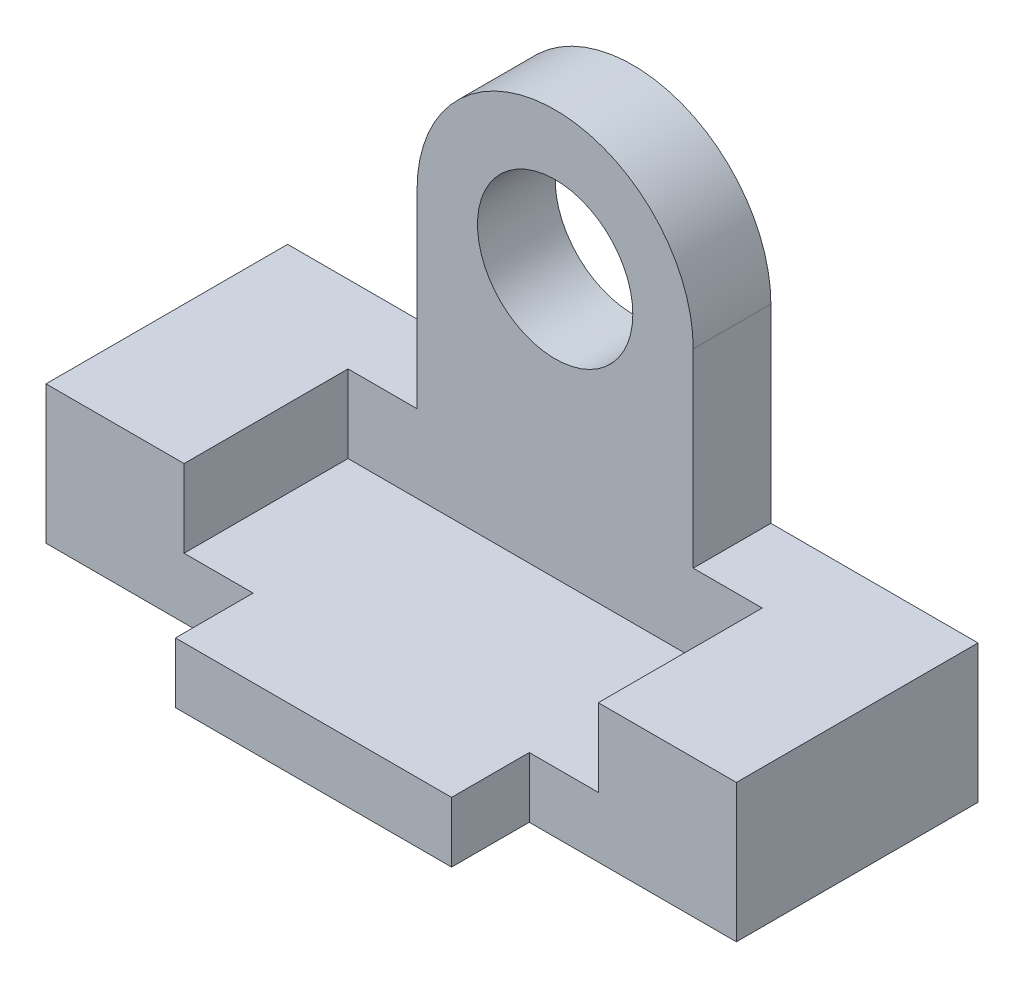
ISO-10303-21;
HEADER;
FILE_DESCRIPTION(('STEP AP214'),'2;1');
FILE_NAME('part.step','',(''),(''),'','','');
FILE_SCHEMA(('AUTOMOTIVE_DESIGN { 1 0 10303 214 1 1 1 1 }'));
ENDSEC;
DATA;
#1=APPLICATION_CONTEXT('core data for automotive mechanical design processes');
#2=APPLICATION_PROTOCOL_DEFINITION('international standard','automotive_design',2000,#1);
#3=PRODUCT_CONTEXT('',#1,'mechanical');
#4=PRODUCT('Part','Part','',(#3));
#5=PRODUCT_RELATED_PRODUCT_CATEGORY('part','',(#4));
#6=PRODUCT_DEFINITION_FORMATION('','',#4);
#7=PRODUCT_DEFINITION_CONTEXT('part definition',#1,'design');
#8=PRODUCT_DEFINITION('design','',#6,#7);
#9=PRODUCT_DEFINITION_SHAPE('','',#8);
#10=(LENGTH_UNIT() NAMED_UNIT(*) SI_UNIT(.MILLI.,.METRE.));
#11=(NAMED_UNIT(*) PLANE_ANGLE_UNIT() SI_UNIT($,.RADIAN.));
#12=(NAMED_UNIT(*) SI_UNIT($,.STERADIAN.) SOLID_ANGLE_UNIT());
#13=UNCERTAINTY_MEASURE_WITH_UNIT(LENGTH_MEASURE(1.E-05),#10,'distance_accuracy_value','');
#14=(GEOMETRIC_REPRESENTATION_CONTEXT(3) GLOBAL_UNCERTAINTY_ASSIGNED_CONTEXT((#13)) GLOBAL_UNIT_ASSIGNED_CONTEXT((#10,
#11,#12)) REPRESENTATION_CONTEXT('',''));
#15=CARTESIAN_POINT('',(0.,0.,0.));
#16=DIRECTION('',(0.,0.,1.));
#17=DIRECTION('',(1.,0.,0.));
#18=AXIS2_PLACEMENT_3D('',#15,#16,#17);
#19=CARTESIAN_POINT('',(0.,16.,0.));
#20=DIRECTION('',(0.,-1.,0.));
#21=DIRECTION('',(0.,0.,-1.));
#22=AXIS2_PLACEMENT_3D('',#19,#20,#21);
#23=PLANE('',#22);
#24=DIRECTION('',(0.,0.,1.));
#25=VECTOR('',#24,1.);
#26=CARTESIAN_POINT('',(-16.,16.,-63.6789693934969));
#27=LINE('',#26,#25);
#28=CARTESIAN_POINT('',(-16.,16.,-14.));
#29=VERTEX_POINT('',#28);
#30=CARTESIAN_POINT('',(-16.,16.,-5.));
#31=VERTEX_POINT('',#30);
#32=EDGE_CURVE('E61',#29,#31,#27,.T.);
#33=ORIENTED_EDGE('',*,*,#32,.F.);
#34=DIRECTION('',(-1.,0.,0.));
#35=VECTOR('',#34,1.);
#36=CARTESIAN_POINT('',(-40.,16.,-14.));
#37=LINE('',#36,#35);
#38=CARTESIAN_POINT('',(-40.,16.,-14.));
#39=VERTEX_POINT('',#38);
#40=EDGE_CURVE('E287',#29,#39,#37,.T.);
#41=ORIENTED_EDGE('',*,*,#40,.T.);
#42=DIRECTION('',(0.,0.,1.));
#43=VECTOR('',#42,1.);
#44=CARTESIAN_POINT('',(-40.,16.,14.));
#45=LINE('',#44,#43);
#46=CARTESIAN_POINT('',(-40.,16.,14.));
#47=VERTEX_POINT('',#46);
#48=EDGE_CURVE('E291',#39,#47,#45,.T.);
#49=ORIENTED_EDGE('',*,*,#48,.T.);
#50=DIRECTION('',(1.,0.,0.));
#51=VECTOR('',#50,1.);
#52=CARTESIAN_POINT('',(-40.,16.,14.));
#53=LINE('',#52,#51);
#54=CARTESIAN_POINT('',(-24.,16.,14.));
#55=VERTEX_POINT('',#54);
#56=EDGE_CURVE('E295',#47,#55,#53,.T.);
#57=ORIENTED_EDGE('',*,*,#56,.T.);
#58=DIRECTION('',(0.,0.,1.));
#59=VECTOR('',#58,1.);
#60=CARTESIAN_POINT('',(-24.,16.,14.));
#61=LINE('',#60,#59);
#62=CARTESIAN_POINT('',(-24.,16.,-5.));
#63=VERTEX_POINT('',#62);
#64=EDGE_CURVE('E159',#63,#55,#61,.T.);
#65=ORIENTED_EDGE('',*,*,#64,.F.);
#66=DIRECTION('',(-1.,0.,0.));
#67=VECTOR('',#66,1.);
#68=CARTESIAN_POINT('',(-24.,16.,-5.));
#69=LINE('',#68,#67);
#70=EDGE_CURVE('E157',#31,#63,#69,.T.);
#71=ORIENTED_EDGE('',*,*,#70,.F.);
#72=EDGE_LOOP('',(#33,#41,#49,#57,#65,#71));
#73=FACE_BOUND('',#72,.T.);
#74=ADVANCED_FACE('F45',(#73),#23,.F.);
#75=CARTESIAN_POINT('',(-40.,16.,14.));
#76=DIRECTION('',(0.,0.,-1.));
#77=DIRECTION('',(-1.,0.,0.));
#78=AXIS2_PLACEMENT_3D('',#75,#76,#77);
#79=PLANE('',#78);
#80=DIRECTION('',(0.,-1.,0.));
#81=VECTOR('',#80,1.);
#82=CARTESIAN_POINT('',(-16.,0.,14.));
#83=LINE('',#82,#81);
#84=CARTESIAN_POINT('',(-16.,7.,14.));
#85=VERTEX_POINT('',#84);
#86=CARTESIAN_POINT('',(-16.,0.,14.));
#87=VERTEX_POINT('',#86);
#88=EDGE_CURVE('E210',#85,#87,#83,.T.);
#89=ORIENTED_EDGE('',*,*,#88,.F.);
#90=DIRECTION('',(1.,0.,0.));
#91=VECTOR('',#90,1.);
#92=CARTESIAN_POINT('',(-24.,7.,14.));
#93=LINE('',#92,#91);
#94=CARTESIAN_POINT('',(-24.,7.,14.));
#95=VERTEX_POINT('',#94);
#96=EDGE_CURVE('E252',#95,#85,#93,.T.);
#97=ORIENTED_EDGE('',*,*,#96,.F.);
#98=DIRECTION('',(0.,1.,0.));
#99=VECTOR('',#98,1.);
#100=CARTESIAN_POINT('',(-24.,7.,14.));
#101=LINE('',#100,#99);
#102=EDGE_CURVE('E264',#95,#55,#101,.T.);
#103=ORIENTED_EDGE('',*,*,#102,.T.);
#104=ORIENTED_EDGE('',*,*,#56,.F.);
#105=DIRECTION('',(0.,-1.,0.));
#106=VECTOR('',#105,1.);
#107=CARTESIAN_POINT('',(-40.,16.,14.));
#108=LINE('',#107,#106);
#109=CARTESIAN_POINT('',(-40.,0.,14.));
#110=VERTEX_POINT('',#109);
#111=EDGE_CURVE('E314',#47,#110,#108,.T.);
#112=ORIENTED_EDGE('',*,*,#111,.T.);
#113=DIRECTION('',(1.,0.,0.));
#114=VECTOR('',#113,1.);
#115=CARTESIAN_POINT('',(-40.,0.,14.));
#116=LINE('',#115,#114);
#117=EDGE_CURVE('E288',#110,#87,#116,.T.);
#118=ORIENTED_EDGE('',*,*,#117,.T.);
#119=EDGE_LOOP('',(#89,#97,#103,#104,#112,#118));
#120=FACE_BOUND('',#119,.T.);
#121=ADVANCED_FACE('F332',(#120),#79,.F.);
#122=DIRECTION('',(0.,1.,0.));
#123=VECTOR('',#122,1.);
#124=CARTESIAN_POINT('',(16.,0.,14.));
#125=LINE('',#124,#123);
#126=CARTESIAN_POINT('',(16.,0.,14.));
#127=VERTEX_POINT('',#126);
#128=CARTESIAN_POINT('',(16.,7.,14.));
#129=VERTEX_POINT('',#128);
#130=EDGE_CURVE('E216',#127,#129,#125,.T.);
#131=ORIENTED_EDGE('',*,*,#130,.F.);
#132=CARTESIAN_POINT('',(40.,0.,14.));
#133=VERTEX_POINT('',#132);
#134=EDGE_CURVE('E308',#127,#133,#116,.T.);
#135=ORIENTED_EDGE('',*,*,#134,.T.);
#136=DIRECTION('',(0.,-1.,0.));
#137=VECTOR('',#136,1.);
#138=CARTESIAN_POINT('',(40.,16.,14.));
#139=LINE('',#138,#137);
#140=CARTESIAN_POINT('',(40.,16.,14.));
#141=VERTEX_POINT('',#140);
#142=EDGE_CURVE('E298',#141,#133,#139,.T.);
#143=ORIENTED_EDGE('',*,*,#142,.F.);
#144=CARTESIAN_POINT('',(24.,16.,14.));
#145=VERTEX_POINT('',#144);
#146=EDGE_CURVE('E294',#145,#141,#53,.T.);
#147=ORIENTED_EDGE('',*,*,#146,.F.);
#148=DIRECTION('',(0.,1.,0.));
#149=VECTOR('',#148,1.);
#150=CARTESIAN_POINT('',(24.,7.,14.));
#151=LINE('',#150,#149);
#152=CARTESIAN_POINT('',(24.,7.,14.));
#153=VERTEX_POINT('',#152);
#154=EDGE_CURVE('E278',#153,#145,#151,.T.);
#155=ORIENTED_EDGE('',*,*,#154,.F.);
#156=EDGE_CURVE('E251',#129,#153,#93,.T.);
#157=ORIENTED_EDGE('',*,*,#156,.F.);
#158=EDGE_LOOP('',(#131,#135,#143,#147,#155,#157));
#159=FACE_BOUND('',#158,.T.);
#160=ADVANCED_FACE('F364',(#159),#79,.F.);
#161=CARTESIAN_POINT('',(40.,16.,14.));
#162=DIRECTION('',(-1.,0.,0.));
#163=DIRECTION('',(0.,0.,1.));
#164=AXIS2_PLACEMENT_3D('',#161,#162,#163);
#165=PLANE('',#164);
#166=DIRECTION('',(0.,0.,-1.));
#167=VECTOR('',#166,1.);
#168=CARTESIAN_POINT('',(40.,0.,14.));
#169=LINE('',#168,#167);
#170=CARTESIAN_POINT('',(40.,0.,-14.));
#171=VERTEX_POINT('',#170);
#172=EDGE_CURVE('E274',#133,#171,#169,.T.);
#173=ORIENTED_EDGE('',*,*,#172,.T.);
#174=DIRECTION('',(0.,-1.,0.));
#175=VECTOR('',#174,1.);
#176=CARTESIAN_POINT('',(40.,16.,-14.));
#177=LINE('',#176,#175);
#178=CARTESIAN_POINT('',(40.,16.,-14.));
#179=VERTEX_POINT('',#178);
#180=EDGE_CURVE('E11',#179,#171,#177,.T.);
#181=ORIENTED_EDGE('',*,*,#180,.F.);
#182=DIRECTION('',(0.,0.,-1.));
#183=VECTOR('',#182,1.);
#184=CARTESIAN_POINT('',(40.,16.,14.));
#185=LINE('',#184,#183);
#186=EDGE_CURVE('E284',#141,#179,#185,.T.);
#187=ORIENTED_EDGE('',*,*,#186,.F.);
#188=ORIENTED_EDGE('',*,*,#142,.T.);
#189=EDGE_LOOP('',(#173,#181,#187,#188));
#190=FACE_BOUND('',#189,.T.);
#191=ADVANCED_FACE('F47',(#190),#165,.F.);
#192=CARTESIAN_POINT('',(-40.,16.,-14.));
#193=DIRECTION('',(0.,0.,1.));
#194=DIRECTION('',(1.,0.,0.));
#195=AXIS2_PLACEMENT_3D('',#192,#193,#194);
#196=PLANE('',#195);
#197=DIRECTION('',(-1.,0.,0.));
#198=VECTOR('',#197,1.);
#199=CARTESIAN_POINT('',(-40.,0.,-14.));
#200=LINE('',#199,#198);
#201=CARTESIAN_POINT('',(-40.,0.,-14.));
#202=VERTEX_POINT('',#201);
#203=EDGE_CURVE('E302',#171,#202,#200,.T.);
#204=ORIENTED_EDGE('',*,*,#203,.T.);
#205=DIRECTION('',(0.,-1.,0.));
#206=VECTOR('',#205,1.);
#207=CARTESIAN_POINT('',(-40.,16.,-14.));
#208=LINE('',#207,#206);
#209=EDGE_CURVE('E54',#39,#202,#208,.T.);
#210=ORIENTED_EDGE('',*,*,#209,.F.);
#211=ORIENTED_EDGE('',*,*,#40,.F.);
#212=DIRECTION('',(0.,1.,0.));
#213=VECTOR('',#212,1.);
#214=CARTESIAN_POINT('',(-16.,16.,-14.));
#215=LINE('',#214,#213);
#216=CARTESIAN_POINT('',(-16.,38.,-14.));
#217=VERTEX_POINT('',#216);
#218=EDGE_CURVE('E174',#29,#217,#215,.T.);
#219=ORIENTED_EDGE('',*,*,#218,.T.);
#220=CARTESIAN_POINT('',(0.,38.,-14.));
#221=DIRECTION('',(0.,0.,1.));
#222=DIRECTION('',(1.,0.,0.));
#223=AXIS2_PLACEMENT_3D('',#220,#221,#222);
#224=CIRCLE('',#223,16.);
#225=CARTESIAN_POINT('',(16.,38.,-14.));
#226=VERTEX_POINT('',#225);
#227=EDGE_CURVE('E340',#217,#226,#224,.F.);
#228=ORIENTED_EDGE('',*,*,#227,.T.);
#229=DIRECTION('',(0.,-1.,0.));
#230=VECTOR('',#229,1.);
#231=CARTESIAN_POINT('',(16.,16.,-14.));
#232=LINE('',#231,#230);
#233=CARTESIAN_POINT('',(16.,16.,-14.));
#234=VERTEX_POINT('',#233);
#235=EDGE_CURVE('E200',#226,#234,#232,.T.);
#236=ORIENTED_EDGE('',*,*,#235,.T.);
#237=EDGE_CURVE('E69',#179,#234,#37,.T.);
#238=ORIENTED_EDGE('',*,*,#237,.F.);
#239=ORIENTED_EDGE('',*,*,#180,.T.);
#240=EDGE_LOOP('',(#204,#210,#211,#219,#228,#236,#238,#239));
#241=FACE_BOUND('',#240,.T.);
#242=CARTESIAN_POINT('',(0.,38.,-14.));
#243=DIRECTION('',(0.,0.,1.));
#244=DIRECTION('',(1.,0.,0.));
#245=AXIS2_PLACEMENT_3D('',#242,#243,#244);
#246=CIRCLE('',#245,9.);
#247=CARTESIAN_POINT('',(9.,38.,-14.));
#248=VERTEX_POINT('',#247);
#249=EDGE_CURVE('E206',#248,#248,#246,.F.);
#250=ORIENTED_EDGE('',*,*,#249,.F.);
#251=EDGE_LOOP('',(#250));
#252=FACE_BOUND('',#251,.T.);
#253=ADVANCED_FACE('F346',(#241,#252),#196,.F.);
#254=CARTESIAN_POINT('',(-40.,16.,14.));
#255=DIRECTION('',(1.,0.,0.));
#256=DIRECTION('',(0.,0.,-1.));
#257=AXIS2_PLACEMENT_3D('',#254,#255,#256);
#258=PLANE('',#257);
#259=DIRECTION('',(0.,0.,1.));
#260=VECTOR('',#259,1.);
#261=CARTESIAN_POINT('',(-40.,0.,14.));
#262=LINE('',#261,#260);
#263=EDGE_CURVE('E305',#202,#110,#262,.T.);
#264=ORIENTED_EDGE('',*,*,#263,.T.);
#265=ORIENTED_EDGE('',*,*,#111,.F.);
#266=ORIENTED_EDGE('',*,*,#48,.F.);
#267=ORIENTED_EDGE('',*,*,#209,.T.);
#268=EDGE_LOOP('',(#264,#265,#266,#267));
#269=FACE_BOUND('',#268,.T.);
#270=ADVANCED_FACE('F323',(#269),#258,.F.);
#271=ORIENTED_EDGE('',*,*,#237,.T.);
#272=DIRECTION('',(0.,0.,1.));
#273=VECTOR('',#272,1.);
#274=CARTESIAN_POINT('',(16.,16.,-63.6789693934969));
#275=LINE('',#274,#273);
#276=CARTESIAN_POINT('',(16.,16.,-5.));
#277=VERTEX_POINT('',#276);
#278=EDGE_CURVE('E176',#234,#277,#275,.T.);
#279=ORIENTED_EDGE('',*,*,#278,.T.);
#280=CARTESIAN_POINT('',(24.,16.,-5.));
#281=VERTEX_POINT('',#280);
#282=EDGE_CURVE('E164',#281,#277,#69,.T.);
#283=ORIENTED_EDGE('',*,*,#282,.F.);
#284=DIRECTION('',(0.,0.,-1.));
#285=VECTOR('',#284,1.);
#286=CARTESIAN_POINT('',(24.,16.,14.));
#287=LINE('',#286,#285);
#288=EDGE_CURVE('E165',#145,#281,#287,.T.);
#289=ORIENTED_EDGE('',*,*,#288,.F.);
#290=ORIENTED_EDGE('',*,*,#146,.T.);
#291=ORIENTED_EDGE('',*,*,#186,.T.);
#292=EDGE_LOOP('',(#271,#279,#283,#289,#290,#291));
#293=FACE_BOUND('',#292,.T.);
#294=ADVANCED_FACE('F354',(#293),#23,.F.);
#295=CARTESIAN_POINT('',(0.,0.,0.));
#296=DIRECTION('',(0.,-1.,0.));
#297=DIRECTION('',(0.,0.,-1.));
#298=AXIS2_PLACEMENT_3D('',#295,#296,#297);
#299=PLANE('',#298);
#300=ORIENTED_EDGE('',*,*,#172,.F.);
#301=ORIENTED_EDGE('',*,*,#134,.F.);
#302=DIRECTION('',(0.,0.,-1.));
#303=VECTOR('',#302,1.);
#304=CARTESIAN_POINT('',(16.,0.,23.));
#305=LINE('',#304,#303);
#306=CARTESIAN_POINT('',(16.,0.,23.));
#307=VERTEX_POINT('',#306);
#308=EDGE_CURVE('E239',#307,#127,#305,.T.);
#309=ORIENTED_EDGE('',*,*,#308,.F.);
#310=DIRECTION('',(1.,0.,0.));
#311=VECTOR('',#310,1.);
#312=CARTESIAN_POINT('',(-16.,0.,23.));
#313=LINE('',#312,#311);
#314=CARTESIAN_POINT('',(-16.,0.,23.));
#315=VERTEX_POINT('',#314);
#316=EDGE_CURVE('E215',#315,#307,#313,.T.);
#317=ORIENTED_EDGE('',*,*,#316,.F.);
#318=DIRECTION('',(0.,0.,-1.));
#319=VECTOR('',#318,1.);
#320=CARTESIAN_POINT('',(-16.,0.,23.));
#321=LINE('',#320,#319);
#322=EDGE_CURVE('E243',#315,#87,#321,.T.);
#323=ORIENTED_EDGE('',*,*,#322,.T.);
#324=ORIENTED_EDGE('',*,*,#117,.F.);
#325=ORIENTED_EDGE('',*,*,#263,.F.);
#326=ORIENTED_EDGE('',*,*,#203,.F.);
#327=EDGE_LOOP('',(#300,#301,#309,#317,#323,#324,#325,#326));
#328=FACE_BOUND('',#327,.T.);
#329=ADVANCED_FACE('F329',(#328),#299,.T.);
#330=CARTESIAN_POINT('',(-24.,7.,14.));
#331=DIRECTION('',(-1.,0.,0.));
#332=DIRECTION('',(0.,0.,1.));
#333=AXIS2_PLACEMENT_3D('',#330,#331,#332);
#334=PLANE('',#333);
#335=ORIENTED_EDGE('',*,*,#64,.T.);
#336=ORIENTED_EDGE('',*,*,#102,.F.);
#337=DIRECTION('',(0.,0.,1.));
#338=VECTOR('',#337,1.);
#339=CARTESIAN_POINT('',(-24.,7.,14.));
#340=LINE('',#339,#338);
#341=CARTESIAN_POINT('',(-24.,7.,-5.));
#342=VERTEX_POINT('',#341);
#343=EDGE_CURVE('E247',#342,#95,#340,.T.);
#344=ORIENTED_EDGE('',*,*,#343,.F.);
#345=DIRECTION('',(0.,1.,0.));
#346=VECTOR('',#345,1.);
#347=CARTESIAN_POINT('',(-24.,7.,-5.));
#348=LINE('',#347,#346);
#349=EDGE_CURVE('E271',#342,#63,#348,.T.);
#350=ORIENTED_EDGE('',*,*,#349,.T.);
#351=EDGE_LOOP('',(#335,#336,#344,#350));
#352=FACE_BOUND('',#351,.T.);
#353=ADVANCED_FACE('F386',(#352),#334,.F.);
#354=CARTESIAN_POINT('',(-24.,7.,-5.));
#355=DIRECTION('',(0.,0.,-1.));
#356=DIRECTION('',(-1.,0.,0.));
#357=AXIS2_PLACEMENT_3D('',#354,#355,#356);
#358=PLANE('',#357);
#359=ORIENTED_EDGE('',*,*,#282,.T.);
#360=DIRECTION('',(0.,1.,0.));
#361=VECTOR('',#360,1.);
#362=CARTESIAN_POINT('',(16.,16.,-5.));
#363=LINE('',#362,#361);
#364=CARTESIAN_POINT('',(16.,38.,-5.));
#365=VERTEX_POINT('',#364);
#366=EDGE_CURVE('E185',#277,#365,#363,.T.);
#367=ORIENTED_EDGE('',*,*,#366,.T.);
#368=CARTESIAN_POINT('',(0.,38.,-5.));
#369=DIRECTION('',(0.,0.,1.));
#370=DIRECTION('',(1.,0.,0.));
#371=AXIS2_PLACEMENT_3D('',#368,#369,#370);
#372=CIRCLE('',#371,16.);
#373=CARTESIAN_POINT('',(-16.,38.,-5.));
#374=VERTEX_POINT('',#373);
#375=EDGE_CURVE('E177',#365,#374,#372,.T.);
#376=ORIENTED_EDGE('',*,*,#375,.T.);
#377=DIRECTION('',(0.,-1.,0.));
#378=VECTOR('',#377,1.);
#379=CARTESIAN_POINT('',(-16.,16.,-5.));
#380=LINE('',#379,#378);
#381=EDGE_CURVE('E172',#374,#31,#380,.T.);
#382=ORIENTED_EDGE('',*,*,#381,.T.);
#383=ORIENTED_EDGE('',*,*,#70,.T.);
#384=ORIENTED_EDGE('',*,*,#349,.F.);
#385=DIRECTION('',(-1.,0.,0.));
#386=VECTOR('',#385,1.);
#387=CARTESIAN_POINT('',(-24.,7.,-5.));
#388=LINE('',#387,#386);
#389=CARTESIAN_POINT('',(24.,7.,-5.));
#390=VERTEX_POINT('',#389);
#391=EDGE_CURVE('E260',#390,#342,#388,.T.);
#392=ORIENTED_EDGE('',*,*,#391,.F.);
#393=DIRECTION('',(0.,1.,0.));
#394=VECTOR('',#393,1.);
#395=CARTESIAN_POINT('',(24.,7.,-5.));
#396=LINE('',#395,#394);
#397=EDGE_CURVE('E275',#390,#281,#396,.T.);
#398=ORIENTED_EDGE('',*,*,#397,.T.);
#399=EDGE_LOOP('',(#359,#367,#376,#382,#383,#384,#392,#398));
#400=FACE_BOUND('',#399,.T.);
#401=CARTESIAN_POINT('',(0.,38.,-5.));
#402=DIRECTION('',(0.,0.,1.));
#403=DIRECTION('',(1.,0.,0.));
#404=AXIS2_PLACEMENT_3D('',#401,#402,#403);
#405=CIRCLE('',#404,9.);
#406=CARTESIAN_POINT('',(9.,38.,-5.));
#407=VERTEX_POINT('',#406);
#408=EDGE_CURVE('E186',#407,#407,#405,.T.);
#409=ORIENTED_EDGE('',*,*,#408,.F.);
#410=EDGE_LOOP('',(#409));
#411=FACE_BOUND('',#410,.T.);
#412=ADVANCED_FACE('F180',(#400,#411),#358,.F.);
#413=CARTESIAN_POINT('',(24.,7.,14.));
#414=DIRECTION('',(1.,0.,0.));
#415=DIRECTION('',(0.,0.,-1.));
#416=AXIS2_PLACEMENT_3D('',#413,#414,#415);
#417=PLANE('',#416);
#418=ORIENTED_EDGE('',*,*,#288,.T.);
#419=ORIENTED_EDGE('',*,*,#397,.F.);
#420=DIRECTION('',(0.,0.,-1.));
#421=VECTOR('',#420,1.);
#422=CARTESIAN_POINT('',(24.,7.,14.));
#423=LINE('',#422,#421);
#424=EDGE_CURVE('E256',#153,#390,#423,.T.);
#425=ORIENTED_EDGE('',*,*,#424,.F.);
#426=ORIENTED_EDGE('',*,*,#154,.T.);
#427=EDGE_LOOP('',(#418,#419,#425,#426));
#428=FACE_BOUND('',#427,.T.);
#429=ADVANCED_FACE('F359',(#428),#417,.F.);
#430=CARTESIAN_POINT('',(0.,7.,0.));
#431=DIRECTION('',(0.,-1.,0.));
#432=DIRECTION('',(0.,0.,-1.));
#433=AXIS2_PLACEMENT_3D('',#430,#431,#432);
#434=PLANE('',#433);
#435=ORIENTED_EDGE('',*,*,#343,.T.);
#436=ORIENTED_EDGE('',*,*,#96,.T.);
#437=DIRECTION('',(0.,0.,-1.));
#438=VECTOR('',#437,1.);
#439=CARTESIAN_POINT('',(-16.,7.,23.));
#440=LINE('',#439,#438);
#441=CARTESIAN_POINT('',(-16.,7.,23.));
#442=VERTEX_POINT('',#441);
#443=EDGE_CURVE('E225',#442,#85,#440,.T.);
#444=ORIENTED_EDGE('',*,*,#443,.F.);
#445=DIRECTION('',(-1.,0.,0.));
#446=VECTOR('',#445,1.);
#447=CARTESIAN_POINT('',(-16.,7.,23.));
#448=LINE('',#447,#446);
#449=CARTESIAN_POINT('',(16.,7.,23.));
#450=VERTEX_POINT('',#449);
#451=EDGE_CURVE('E222',#450,#442,#448,.T.);
#452=ORIENTED_EDGE('',*,*,#451,.F.);
#453=DIRECTION('',(0.,0.,-1.));
#454=VECTOR('',#453,1.);
#455=CARTESIAN_POINT('',(16.,7.,23.));
#456=LINE('',#455,#454);
#457=EDGE_CURVE('E235',#450,#129,#456,.T.);
#458=ORIENTED_EDGE('',*,*,#457,.T.);
#459=ORIENTED_EDGE('',*,*,#156,.T.);
#460=ORIENTED_EDGE('',*,*,#424,.T.);
#461=ORIENTED_EDGE('',*,*,#391,.T.);
#462=EDGE_LOOP('',(#435,#436,#444,#452,#458,#459,#460,#461));
#463=FACE_BOUND('',#462,.T.);
#464=ADVANCED_FACE('F383',(#463),#434,.F.);
#465=CARTESIAN_POINT('',(-16.,0.,23.));
#466=DIRECTION('',(1.,0.,0.));
#467=DIRECTION('',(0.,0.,-1.));
#468=AXIS2_PLACEMENT_3D('',#465,#466,#467);
#469=PLANE('',#468);
#470=ORIENTED_EDGE('',*,*,#88,.T.);
#471=ORIENTED_EDGE('',*,*,#322,.F.);
#472=DIRECTION('',(0.,-1.,0.));
#473=VECTOR('',#472,1.);
#474=CARTESIAN_POINT('',(-16.,0.,23.));
#475=LINE('',#474,#473);
#476=EDGE_CURVE('E211',#442,#315,#475,.T.);
#477=ORIENTED_EDGE('',*,*,#476,.F.);
#478=ORIENTED_EDGE('',*,*,#443,.T.);
#479=EDGE_LOOP('',(#470,#471,#477,#478));
#480=FACE_BOUND('',#479,.T.);
#481=ADVANCED_FACE('F381',(#480),#469,.F.);
#482=CARTESIAN_POINT('',(16.,0.,23.));
#483=DIRECTION('',(-1.,0.,0.));
#484=DIRECTION('',(0.,0.,1.));
#485=AXIS2_PLACEMENT_3D('',#482,#483,#484);
#486=PLANE('',#485);
#487=ORIENTED_EDGE('',*,*,#130,.T.);
#488=ORIENTED_EDGE('',*,*,#457,.F.);
#489=DIRECTION('',(0.,1.,0.));
#490=VECTOR('',#489,1.);
#491=CARTESIAN_POINT('',(16.,0.,23.));
#492=LINE('',#491,#490);
#493=EDGE_CURVE('E219',#307,#450,#492,.T.);
#494=ORIENTED_EDGE('',*,*,#493,.F.);
#495=ORIENTED_EDGE('',*,*,#308,.T.);
#496=EDGE_LOOP('',(#487,#488,#494,#495));
#497=FACE_BOUND('',#496,.T.);
#498=ADVANCED_FACE('F373',(#497),#486,.F.);
#499=CARTESIAN_POINT('',(0.,0.,23.));
#500=DIRECTION('',(0.,0.,-1.));
#501=DIRECTION('',(-1.,0.,0.));
#502=AXIS2_PLACEMENT_3D('',#499,#500,#501);
#503=PLANE('',#502);
#504=ORIENTED_EDGE('',*,*,#476,.T.);
#505=ORIENTED_EDGE('',*,*,#316,.T.);
#506=ORIENTED_EDGE('',*,*,#493,.T.);
#507=ORIENTED_EDGE('',*,*,#451,.T.);
#508=EDGE_LOOP('',(#504,#505,#506,#507));
#509=FACE_BOUND('',#508,.T.);
#510=ADVANCED_FACE('F377',(#509),#503,.F.);
#511=CARTESIAN_POINT('',(16.,16.,-63.6789693934969));
#512=DIRECTION('',(1.,0.,0.));
#513=DIRECTION('',(0.,0.,-1.));
#514=AXIS2_PLACEMENT_3D('',#511,#512,#513);
#515=PLANE('',#514);
#516=ORIENTED_EDGE('',*,*,#235,.F.);
#517=DIRECTION('',(0.,0.,1.));
#518=VECTOR('',#517,1.);
#519=CARTESIAN_POINT('',(16.,38.,-63.6789693934969));
#520=LINE('',#519,#518);
#521=EDGE_CURVE('E201',#226,#365,#520,.T.);
#522=ORIENTED_EDGE('',*,*,#521,.T.);
#523=ORIENTED_EDGE('',*,*,#366,.F.);
#524=ORIENTED_EDGE('',*,*,#278,.F.);
#525=EDGE_LOOP('',(#516,#522,#523,#524));
#526=FACE_BOUND('',#525,.T.);
#527=ADVANCED_FACE('F352',(#526),#515,.T.);
#528=CARTESIAN_POINT('',(0.,38.,-63.6789693934969));
#529=DIRECTION('',(0.,0.,1.));
#530=DIRECTION('',(1.,0.,0.));
#531=AXIS2_PLACEMENT_3D('',#528,#529,#530);
#532=CYLINDRICAL_SURFACE('',#531,16.);
#533=ORIENTED_EDGE('',*,*,#227,.F.);
#534=DIRECTION('',(0.,0.,1.));
#535=VECTOR('',#534,1.);
#536=CARTESIAN_POINT('',(-16.,38.,-63.6789693934969));
#537=LINE('',#536,#535);
#538=EDGE_CURVE('E197',#217,#374,#537,.T.);
#539=ORIENTED_EDGE('',*,*,#538,.T.);
#540=ORIENTED_EDGE('',*,*,#375,.F.);
#541=ORIENTED_EDGE('',*,*,#521,.F.);
#542=EDGE_LOOP('',(#533,#539,#540,#541));
#543=FACE_BOUND('',#542,.T.);
#544=ADVANCED_FACE('F484',(#543),#532,.T.);
#545=CARTESIAN_POINT('',(-16.,16.,-63.6789693934969));
#546=DIRECTION('',(-1.,0.,0.));
#547=DIRECTION('',(0.,0.,1.));
#548=AXIS2_PLACEMENT_3D('',#545,#546,#547);
#549=PLANE('',#548);
#550=ORIENTED_EDGE('',*,*,#218,.F.);
#551=ORIENTED_EDGE('',*,*,#32,.T.);
#552=ORIENTED_EDGE('',*,*,#381,.F.);
#553=ORIENTED_EDGE('',*,*,#538,.F.);
#554=EDGE_LOOP('',(#550,#551,#552,#553));
#555=FACE_BOUND('',#554,.T.);
#556=ADVANCED_FACE('F170',(#555),#549,.T.);
#557=CARTESIAN_POINT('',(0.,38.,-63.6789693934969));
#558=DIRECTION('',(0.,0.,1.));
#559=DIRECTION('',(1.,0.,0.));
#560=AXIS2_PLACEMENT_3D('',#557,#558,#559);
#561=CYLINDRICAL_SURFACE('',#560,9.);
#562=ORIENTED_EDGE('',*,*,#249,.T.);
#563=EDGE_LOOP('',(#562));
#564=FACE_BOUND('',#563,.T.);
#565=ORIENTED_EDGE('',*,*,#408,.T.);
#566=EDGE_LOOP('',(#565));
#567=FACE_BOUND('',#566,.T.);
#568=ADVANCED_FACE('F502',(#564,#567),#561,.F.);
#569=CLOSED_SHELL('',(#74,#121,#160,#191,#253,#270,#294,#329,#353,#412,#429,#464,#481,#498,#510,
#527,#544,#556,#568));
#570=MANIFOLD_SOLID_BREP('B2',#569);
#571=ADVANCED_BREP_SHAPE_REPRESENTATION('',(#18,#570),#14);
#572=SHAPE_DEFINITION_REPRESENTATION(#9,#571);
ENDSEC;
END-ISO-10303-21;
